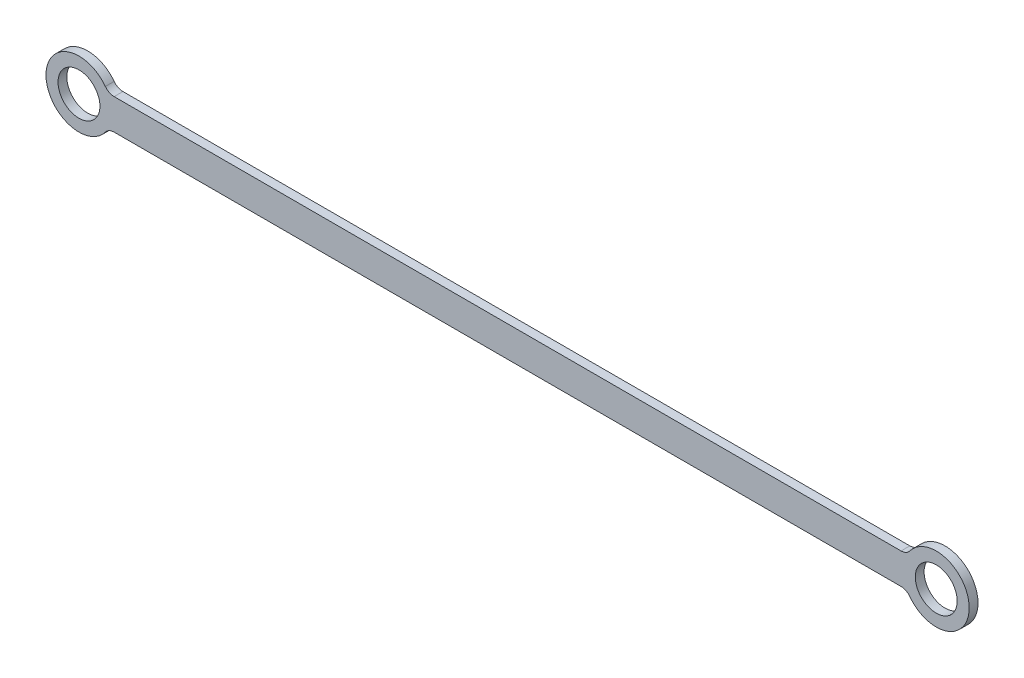
ISO-10303-21;
HEADER;
FILE_DESCRIPTION(('STEP AP214'),'2;1');
FILE_NAME('part.step','',(''),(''),'','','');
FILE_SCHEMA(('AUTOMOTIVE_DESIGN { 1 0 10303 214 1 1 1 1 }'));
ENDSEC;
DATA;
#1=APPLICATION_CONTEXT('core data for automotive mechanical design processes');
#2=APPLICATION_PROTOCOL_DEFINITION('international standard','automotive_design',2000,#1);
#3=PRODUCT_CONTEXT('',#1,'mechanical');
#4=PRODUCT('Part','Part','',(#3));
#5=PRODUCT_RELATED_PRODUCT_CATEGORY('part','',(#4));
#6=PRODUCT_DEFINITION_FORMATION('','',#4);
#7=PRODUCT_DEFINITION_CONTEXT('part definition',#1,'design');
#8=PRODUCT_DEFINITION('design','',#6,#7);
#9=PRODUCT_DEFINITION_SHAPE('','',#8);
#10=(LENGTH_UNIT() NAMED_UNIT(*) SI_UNIT(.MILLI.,.METRE.));
#11=(NAMED_UNIT(*) PLANE_ANGLE_UNIT() SI_UNIT($,.RADIAN.));
#12=(NAMED_UNIT(*) SI_UNIT($,.STERADIAN.) SOLID_ANGLE_UNIT());
#13=UNCERTAINTY_MEASURE_WITH_UNIT(LENGTH_MEASURE(1.E-05),#10,'distance_accuracy_value','');
#14=(GEOMETRIC_REPRESENTATION_CONTEXT(3) GLOBAL_UNCERTAINTY_ASSIGNED_CONTEXT((#13)) GLOBAL_UNIT_ASSIGNED_CONTEXT((#10,
#11,#12)) REPRESENTATION_CONTEXT('',''));
#15=CARTESIAN_POINT('',(0.,0.,0.));
#16=DIRECTION('',(0.,0.,1.));
#17=DIRECTION('',(1.,0.,0.));
#18=AXIS2_PLACEMENT_3D('',#15,#16,#17);
#19=CARTESIAN_POINT('',(-178.999999999999,12.,4.));
#20=DIRECTION('',(0.,0.,-1.));
#21=DIRECTION('',(-1.,0.,0.));
#22=AXIS2_PLACEMENT_3D('',#19,#20,#21);
#23=PLANE('',#22);
#24=CARTESIAN_POINT('',(-178.999999999999,12.,4.));
#25=DIRECTION('',(0.,0.,-1.));
#26=DIRECTION('',(-1.,0.,0.));
#27=AXIS2_PLACEMENT_3D('',#24,#25,#26);
#28=CIRCLE('',#27,5.);
#29=CARTESIAN_POINT('',(-178.999999999999,6.99999999999999,4.));
#30=VERTEX_POINT('',#29);
#31=CARTESIAN_POINT('',(-182.999999999999,8.99999999999999,4.));
#32=VERTEX_POINT('',#31);
#33=EDGE_CURVE('E164',#30,#32,#28,.T.);
#34=ORIENTED_EDGE('',*,*,#33,.T.);
#35=CARTESIAN_POINT('',(-194.999999999999,0.,4.));
#36=DIRECTION('',(0.,0.,1.));
#37=DIRECTION('',(-1.,0.,0.));
#38=AXIS2_PLACEMENT_3D('',#35,#36,#37);
#39=CIRCLE('',#38,15.);
#40=CARTESIAN_POINT('',(-182.999999999999,-8.99999999999951,4.));
#41=VERTEX_POINT('',#40);
#42=EDGE_CURVE('E100',#32,#41,#39,.T.);
#43=ORIENTED_EDGE('',*,*,#42,.T.);
#44=CARTESIAN_POINT('',(-178.999999999999,-11.9999999999993,4.));
#45=DIRECTION('',(0.,0.,-1.));
#46=DIRECTION('',(1.,0.,0.));
#47=AXIS2_PLACEMENT_3D('',#44,#45,#46);
#48=CIRCLE('',#47,5.);
#49=CARTESIAN_POINT('',(-178.999999999999,-6.99999999999935,4.));
#50=VERTEX_POINT('',#49);
#51=EDGE_CURVE('E185',#41,#50,#48,.T.);
#52=ORIENTED_EDGE('',*,*,#51,.T.);
#53=DIRECTION('',(1.,0.,0.));
#54=VECTOR('',#53,1.);
#55=CARTESIAN_POINT('',(179.,-6.99999999999935,4.));
#56=LINE('',#55,#54);
#57=CARTESIAN_POINT('',(179.,-6.99999999999934,4.));
#58=VERTEX_POINT('',#57);
#59=EDGE_CURVE('E199',#50,#58,#56,.T.);
#60=ORIENTED_EDGE('',*,*,#59,.T.);
#61=CARTESIAN_POINT('',(179.,-11.9999999999993,4.));
#62=DIRECTION('',(0.,0.,-1.));
#63=DIRECTION('',(1.,0.,0.));
#64=AXIS2_PLACEMENT_3D('',#61,#62,#63);
#65=CIRCLE('',#64,5.);
#66=CARTESIAN_POINT('',(183.,-8.99999999999933,4.));
#67=VERTEX_POINT('',#66);
#68=EDGE_CURVE('E119',#58,#67,#65,.T.);
#69=ORIENTED_EDGE('',*,*,#68,.T.);
#70=CARTESIAN_POINT('',(195.,3.20923843055709E-13,4.));
#71=DIRECTION('',(0.,0.,1.));
#72=DIRECTION('',(1.,0.,0.));
#73=AXIS2_PLACEMENT_3D('',#70,#71,#72);
#74=CIRCLE('',#73,14.9999999999994);
#75=CARTESIAN_POINT('',(183.,8.99999999999998,4.));
#76=VERTEX_POINT('',#75);
#77=EDGE_CURVE('E113',#67,#76,#74,.T.);
#78=ORIENTED_EDGE('',*,*,#77,.T.);
#79=CARTESIAN_POINT('',(179.,12.,4.));
#80=DIRECTION('',(0.,0.,-1.));
#81=DIRECTION('',(-1.,0.,0.));
#82=AXIS2_PLACEMENT_3D('',#79,#80,#81);
#83=CIRCLE('',#82,5.00000000000001);
#84=CARTESIAN_POINT('',(179.,6.99999999999999,4.));
#85=VERTEX_POINT('',#84);
#86=EDGE_CURVE('E117',#76,#85,#83,.T.);
#87=ORIENTED_EDGE('',*,*,#86,.T.);
#88=DIRECTION('',(-1.,0.,0.));
#89=VECTOR('',#88,1.);
#90=CARTESIAN_POINT('',(-178.999999999999,6.99999999999999,4.));
#91=LINE('',#90,#89);
#92=EDGE_CURVE('E57',#85,#30,#91,.T.);
#93=ORIENTED_EDGE('',*,*,#92,.T.);
#94=EDGE_LOOP('',(#34,#43,#52,#60,#69,#78,#87,#93));
#95=FACE_BOUND('',#94,.T.);
#96=CARTESIAN_POINT('',(-194.999999999999,0.,4.));
#97=DIRECTION('',(0.,0.,1.));
#98=DIRECTION('',(1.,0.,0.));
#99=AXIS2_PLACEMENT_3D('',#96,#97,#98);
#100=CIRCLE('',#99,9.52999999999996);
#101=CARTESIAN_POINT('',(-185.469999999999,0.,4.));
#102=VERTEX_POINT('',#101);
#103=EDGE_CURVE('E146',#102,#102,#100,.T.);
#104=ORIENTED_EDGE('',*,*,#103,.F.);
#105=EDGE_LOOP('',(#104));
#106=FACE_BOUND('',#105,.T.);
#107=CARTESIAN_POINT('',(195.,3.21791204793698E-13,4.));
#108=DIRECTION('',(0.,0.,1.));
#109=DIRECTION('',(1.,0.,0.));
#110=AXIS2_PLACEMENT_3D('',#107,#108,#109);
#111=CIRCLE('',#110,9.53000000000001);
#112=CARTESIAN_POINT('',(204.53,3.21791204793698E-13,4.));
#113=VERTEX_POINT('',#112);
#114=EDGE_CURVE('E213',#113,#113,#111,.T.);
#115=ORIENTED_EDGE('',*,*,#114,.F.);
#116=EDGE_LOOP('',(#115));
#117=FACE_BOUND('',#116,.T.);
#118=ADVANCED_FACE('F39',(#95,#106,#117),#23,.F.);
#119=CARTESIAN_POINT('',(-178.999999999999,12.,0.));
#120=DIRECTION('',(0.,0.,-1.));
#121=DIRECTION('',(-1.,0.,0.));
#122=AXIS2_PLACEMENT_3D('',#119,#120,#121);
#123=PLANE('',#122);
#124=CARTESIAN_POINT('',(-194.999999999999,0.,0.));
#125=DIRECTION('',(0.,0.,1.));
#126=DIRECTION('',(1.,0.,0.));
#127=AXIS2_PLACEMENT_3D('',#124,#125,#126);
#128=CIRCLE('',#127,9.52999999999996);
#129=CARTESIAN_POINT('',(-185.469999999999,0.,0.));
#130=VERTEX_POINT('',#129);
#131=EDGE_CURVE('E209',#130,#130,#128,.T.);
#132=ORIENTED_EDGE('',*,*,#131,.T.);
#133=EDGE_LOOP('',(#132));
#134=FACE_BOUND('',#133,.T.);
#135=CARTESIAN_POINT('',(-178.999999999999,12.,0.));
#136=DIRECTION('',(0.,0.,-1.));
#137=DIRECTION('',(-1.,0.,0.));
#138=AXIS2_PLACEMENT_3D('',#135,#136,#137);
#139=CIRCLE('',#138,5.);
#140=CARTESIAN_POINT('',(-178.999999999999,6.99999999999999,0.));
#141=VERTEX_POINT('',#140);
#142=CARTESIAN_POINT('',(-182.999999999999,8.99999999999999,0.));
#143=VERTEX_POINT('',#142);
#144=EDGE_CURVE('E141',#141,#143,#139,.T.);
#145=ORIENTED_EDGE('',*,*,#144,.F.);
#146=DIRECTION('',(-1.,0.,0.));
#147=VECTOR('',#146,1.);
#148=CARTESIAN_POINT('',(-178.999999999999,6.99999999999999,0.));
#149=LINE('',#148,#147);
#150=CARTESIAN_POINT('',(179.,6.99999999999999,0.));
#151=VERTEX_POINT('',#150);
#152=EDGE_CURVE('E92',#151,#141,#149,.T.);
#153=ORIENTED_EDGE('',*,*,#152,.F.);
#154=CARTESIAN_POINT('',(179.,12.,0.));
#155=DIRECTION('',(0.,0.,-1.));
#156=DIRECTION('',(-1.,0.,0.));
#157=AXIS2_PLACEMENT_3D('',#154,#155,#156);
#158=CIRCLE('',#157,5.00000000000001);
#159=CARTESIAN_POINT('',(183.,8.99999999999998,0.));
#160=VERTEX_POINT('',#159);
#161=EDGE_CURVE('E86',#160,#151,#158,.T.);
#162=ORIENTED_EDGE('',*,*,#161,.F.);
#163=CARTESIAN_POINT('',(195.,3.20923843055709E-13,0.));
#164=DIRECTION('',(0.,0.,1.));
#165=DIRECTION('',(1.,0.,0.));
#166=AXIS2_PLACEMENT_3D('',#163,#164,#165);
#167=CIRCLE('',#166,14.9999999999994);
#168=CARTESIAN_POINT('',(183.,-8.99999999999933,0.));
#169=VERTEX_POINT('',#168);
#170=EDGE_CURVE('E128',#169,#160,#167,.T.);
#171=ORIENTED_EDGE('',*,*,#170,.F.);
#172=CARTESIAN_POINT('',(179.,-11.9999999999993,0.));
#173=DIRECTION('',(0.,0.,-1.));
#174=DIRECTION('',(1.,0.,0.));
#175=AXIS2_PLACEMENT_3D('',#172,#173,#174);
#176=CIRCLE('',#175,5.);
#177=CARTESIAN_POINT('',(179.,-6.99999999999934,0.));
#178=VERTEX_POINT('',#177);
#179=EDGE_CURVE('E155',#178,#169,#176,.T.);
#180=ORIENTED_EDGE('',*,*,#179,.F.);
#181=DIRECTION('',(1.,0.,0.));
#182=VECTOR('',#181,1.);
#183=CARTESIAN_POINT('',(179.,-6.99999999999935,0.));
#184=LINE('',#183,#182);
#185=CARTESIAN_POINT('',(-178.999999999999,-6.99999999999935,0.));
#186=VERTEX_POINT('',#185);
#187=EDGE_CURVE('E152',#186,#178,#184,.T.);
#188=ORIENTED_EDGE('',*,*,#187,.F.);
#189=CARTESIAN_POINT('',(-178.999999999999,-11.9999999999993,0.));
#190=DIRECTION('',(0.,0.,-1.));
#191=DIRECTION('',(1.,0.,0.));
#192=AXIS2_PLACEMENT_3D('',#189,#190,#191);
#193=CIRCLE('',#192,5.);
#194=CARTESIAN_POINT('',(-182.999999999999,-8.99999999999951,0.));
#195=VERTEX_POINT('',#194);
#196=EDGE_CURVE('E149',#195,#186,#193,.T.);
#197=ORIENTED_EDGE('',*,*,#196,.F.);
#198=CARTESIAN_POINT('',(-194.999999999999,0.,0.));
#199=DIRECTION('',(0.,0.,1.));
#200=DIRECTION('',(-1.,0.,0.));
#201=AXIS2_PLACEMENT_3D('',#198,#199,#200);
#202=CIRCLE('',#201,15.);
#203=EDGE_CURVE('E145',#143,#195,#202,.T.);
#204=ORIENTED_EDGE('',*,*,#203,.F.);
#205=EDGE_LOOP('',(#145,#153,#162,#171,#180,#188,#197,#204));
#206=FACE_BOUND('',#205,.T.);
#207=CARTESIAN_POINT('',(195.,3.21791204793698E-13,0.));
#208=DIRECTION('',(0.,0.,1.));
#209=DIRECTION('',(1.,0.,0.));
#210=AXIS2_PLACEMENT_3D('',#207,#208,#209);
#211=CIRCLE('',#210,9.53000000000001);
#212=CARTESIAN_POINT('',(204.53,3.21791204793698E-13,0.));
#213=VERTEX_POINT('',#212);
#214=EDGE_CURVE('E217',#213,#213,#211,.T.);
#215=ORIENTED_EDGE('',*,*,#214,.T.);
#216=EDGE_LOOP('',(#215));
#217=FACE_BOUND('',#216,.T.);
#218=ADVANCED_FACE('F189',(#134,#206,#217),#123,.T.);
#219=CARTESIAN_POINT('',(-178.999999999999,12.,4.));
#220=DIRECTION('',(0.,0.,-1.));
#221=DIRECTION('',(-1.,0.,0.));
#222=AXIS2_PLACEMENT_3D('',#219,#220,#221);
#223=CYLINDRICAL_SURFACE('',#222,5.);
#224=ORIENTED_EDGE('',*,*,#144,.T.);
#225=DIRECTION('',(0.,0.,-1.));
#226=VECTOR('',#225,1.);
#227=CARTESIAN_POINT('',(-182.999999999999,8.99999999999999,4.));
#228=LINE('',#227,#226);
#229=EDGE_CURVE('E11',#32,#143,#228,.T.);
#230=ORIENTED_EDGE('',*,*,#229,.F.);
#231=ORIENTED_EDGE('',*,*,#33,.F.);
#232=DIRECTION('',(0.,0.,-1.));
#233=VECTOR('',#232,1.);
#234=CARTESIAN_POINT('',(-178.999999999999,6.99999999999999,4.));
#235=LINE('',#234,#233);
#236=EDGE_CURVE('E137',#30,#141,#235,.T.);
#237=ORIENTED_EDGE('',*,*,#236,.T.);
#238=EDGE_LOOP('',(#224,#230,#231,#237));
#239=FACE_BOUND('',#238,.T.);
#240=ADVANCED_FACE('F41',(#239),#223,.F.);
#241=CARTESIAN_POINT('',(-194.999999999999,0.,4.));
#242=DIRECTION('',(0.,0.,-1.));
#243=DIRECTION('',(-1.,0.,0.));
#244=AXIS2_PLACEMENT_3D('',#241,#242,#243);
#245=CYLINDRICAL_SURFACE('',#244,15.);
#246=ORIENTED_EDGE('',*,*,#203,.T.);
#247=DIRECTION('',(0.,0.,-1.));
#248=VECTOR('',#247,1.);
#249=CARTESIAN_POINT('',(-182.999999999999,-8.99999999999951,4.));
#250=LINE('',#249,#248);
#251=EDGE_CURVE('E49',#41,#195,#250,.T.);
#252=ORIENTED_EDGE('',*,*,#251,.F.);
#253=ORIENTED_EDGE('',*,*,#42,.F.);
#254=ORIENTED_EDGE('',*,*,#229,.T.);
#255=EDGE_LOOP('',(#246,#252,#253,#254));
#256=FACE_BOUND('',#255,.T.);
#257=ADVANCED_FACE('F251',(#256),#245,.T.);
#258=CARTESIAN_POINT('',(-178.999999999999,-11.9999999999993,4.));
#259=DIRECTION('',(0.,0.,-1.));
#260=DIRECTION('',(-1.,0.,0.));
#261=AXIS2_PLACEMENT_3D('',#258,#259,#260);
#262=CYLINDRICAL_SURFACE('',#261,5.);
#263=ORIENTED_EDGE('',*,*,#196,.T.);
#264=DIRECTION('',(0.,0.,-1.));
#265=VECTOR('',#264,1.);
#266=CARTESIAN_POINT('',(-178.999999999999,-6.99999999999935,4.));
#267=LINE('',#266,#265);
#268=EDGE_CURVE('E175',#50,#186,#267,.T.);
#269=ORIENTED_EDGE('',*,*,#268,.F.);
#270=ORIENTED_EDGE('',*,*,#51,.F.);
#271=ORIENTED_EDGE('',*,*,#251,.T.);
#272=EDGE_LOOP('',(#263,#269,#270,#271));
#273=FACE_BOUND('',#272,.T.);
#274=ADVANCED_FACE('F183',(#273),#262,.F.);
#275=CARTESIAN_POINT('',(179.,-6.99999999999935,4.));
#276=DIRECTION('',(0.,1.,0.));
#277=DIRECTION('',(0.,0.,1.));
#278=AXIS2_PLACEMENT_3D('',#275,#276,#277);
#279=PLANE('',#278);
#280=ORIENTED_EDGE('',*,*,#187,.T.);
#281=DIRECTION('',(0.,0.,-1.));
#282=VECTOR('',#281,1.);
#283=CARTESIAN_POINT('',(179.,-6.99999999999934,4.));
#284=LINE('',#283,#282);
#285=EDGE_CURVE('E171',#58,#178,#284,.T.);
#286=ORIENTED_EDGE('',*,*,#285,.F.);
#287=ORIENTED_EDGE('',*,*,#59,.F.);
#288=ORIENTED_EDGE('',*,*,#268,.T.);
#289=EDGE_LOOP('',(#280,#286,#287,#288));
#290=FACE_BOUND('',#289,.T.);
#291=ADVANCED_FACE('F194',(#290),#279,.F.);
#292=CARTESIAN_POINT('',(179.,-11.9999999999993,4.));
#293=DIRECTION('',(0.,0.,-1.));
#294=DIRECTION('',(-1.,0.,0.));
#295=AXIS2_PLACEMENT_3D('',#292,#293,#294);
#296=CYLINDRICAL_SURFACE('',#295,5.);
#297=ORIENTED_EDGE('',*,*,#179,.T.);
#298=DIRECTION('',(0.,0.,-1.));
#299=VECTOR('',#298,1.);
#300=CARTESIAN_POINT('',(183.,-8.99999999999933,4.));
#301=LINE('',#300,#299);
#302=EDGE_CURVE('E130',#67,#169,#301,.T.);
#303=ORIENTED_EDGE('',*,*,#302,.F.);
#304=ORIENTED_EDGE('',*,*,#68,.F.);
#305=ORIENTED_EDGE('',*,*,#285,.T.);
#306=EDGE_LOOP('',(#297,#303,#304,#305));
#307=FACE_BOUND('',#306,.T.);
#308=ADVANCED_FACE('F197',(#307),#296,.F.);
#309=CARTESIAN_POINT('',(195.,3.20923843055709E-13,4.));
#310=DIRECTION('',(0.,0.,-1.));
#311=DIRECTION('',(-1.,0.,0.));
#312=AXIS2_PLACEMENT_3D('',#309,#310,#311);
#313=CYLINDRICAL_SURFACE('',#312,14.9999999999994);
#314=ORIENTED_EDGE('',*,*,#170,.T.);
#315=DIRECTION('',(0.,0.,-1.));
#316=VECTOR('',#315,1.);
#317=CARTESIAN_POINT('',(183.,8.99999999999998,4.));
#318=LINE('',#317,#316);
#319=EDGE_CURVE('E125',#76,#160,#318,.T.);
#320=ORIENTED_EDGE('',*,*,#319,.F.);
#321=ORIENTED_EDGE('',*,*,#77,.F.);
#322=ORIENTED_EDGE('',*,*,#302,.T.);
#323=EDGE_LOOP('',(#314,#320,#321,#322));
#324=FACE_BOUND('',#323,.T.);
#325=ADVANCED_FACE('F126',(#324),#313,.T.);
#326=CARTESIAN_POINT('',(179.,12.,4.));
#327=DIRECTION('',(0.,0.,-1.));
#328=DIRECTION('',(-1.,0.,0.));
#329=AXIS2_PLACEMENT_3D('',#326,#327,#328);
#330=CYLINDRICAL_SURFACE('',#329,5.00000000000001);
#331=ORIENTED_EDGE('',*,*,#161,.T.);
#332=DIRECTION('',(0.,0.,-1.));
#333=VECTOR('',#332,1.);
#334=CARTESIAN_POINT('',(179.,6.99999999999999,4.));
#335=LINE('',#334,#333);
#336=EDGE_CURVE('E131',#85,#151,#335,.T.);
#337=ORIENTED_EDGE('',*,*,#336,.F.);
#338=ORIENTED_EDGE('',*,*,#86,.F.);
#339=ORIENTED_EDGE('',*,*,#319,.T.);
#340=EDGE_LOOP('',(#331,#337,#338,#339));
#341=FACE_BOUND('',#340,.T.);
#342=ADVANCED_FACE('F133',(#341),#330,.F.);
#343=CARTESIAN_POINT('',(-178.999999999999,6.99999999999999,4.));
#344=DIRECTION('',(0.,-1.,0.));
#345=DIRECTION('',(0.,0.,-1.));
#346=AXIS2_PLACEMENT_3D('',#343,#344,#345);
#347=PLANE('',#346);
#348=ORIENTED_EDGE('',*,*,#152,.T.);
#349=ORIENTED_EDGE('',*,*,#236,.F.);
#350=ORIENTED_EDGE('',*,*,#92,.F.);
#351=ORIENTED_EDGE('',*,*,#336,.T.);
#352=EDGE_LOOP('',(#348,#349,#350,#351));
#353=FACE_BOUND('',#352,.T.);
#354=ADVANCED_FACE('F239',(#353),#347,.F.);
#355=CARTESIAN_POINT('',(-194.999999999999,0.,4.));
#356=DIRECTION('',(0.,0.,-1.));
#357=DIRECTION('',(-1.,0.,0.));
#358=AXIS2_PLACEMENT_3D('',#355,#356,#357);
#359=CYLINDRICAL_SURFACE('',#358,9.52999999999996);
#360=ORIENTED_EDGE('',*,*,#103,.T.);
#361=EDGE_LOOP('',(#360));
#362=FACE_BOUND('',#361,.T.);
#363=ORIENTED_EDGE('',*,*,#131,.F.);
#364=EDGE_LOOP('',(#363));
#365=FACE_BOUND('',#364,.T.);
#366=ADVANCED_FACE('F236',(#362,#365),#359,.F.);
#367=CARTESIAN_POINT('',(195.,3.21791204793698E-13,4.));
#368=DIRECTION('',(0.,0.,-1.));
#369=DIRECTION('',(-1.,0.,0.));
#370=AXIS2_PLACEMENT_3D('',#367,#368,#369);
#371=CYLINDRICAL_SURFACE('',#370,9.53000000000001);
#372=ORIENTED_EDGE('',*,*,#114,.T.);
#373=EDGE_LOOP('',(#372));
#374=FACE_BOUND('',#373,.T.);
#375=ORIENTED_EDGE('',*,*,#214,.F.);
#376=EDGE_LOOP('',(#375));
#377=FACE_BOUND('',#376,.T.);
#378=ADVANCED_FACE('F225',(#374,#377),#371,.F.);
#379=CLOSED_SHELL('',(#118,#218,#240,#257,#274,#291,#308,#325,#342,#354,#366,#378));
#380=MANIFOLD_SOLID_BREP('B2',#379);
#381=ADVANCED_BREP_SHAPE_REPRESENTATION('',(#18,#380),#14);
#382=SHAPE_DEFINITION_REPRESENTATION(#9,#381);
ENDSEC;
END-ISO-10303-21;
